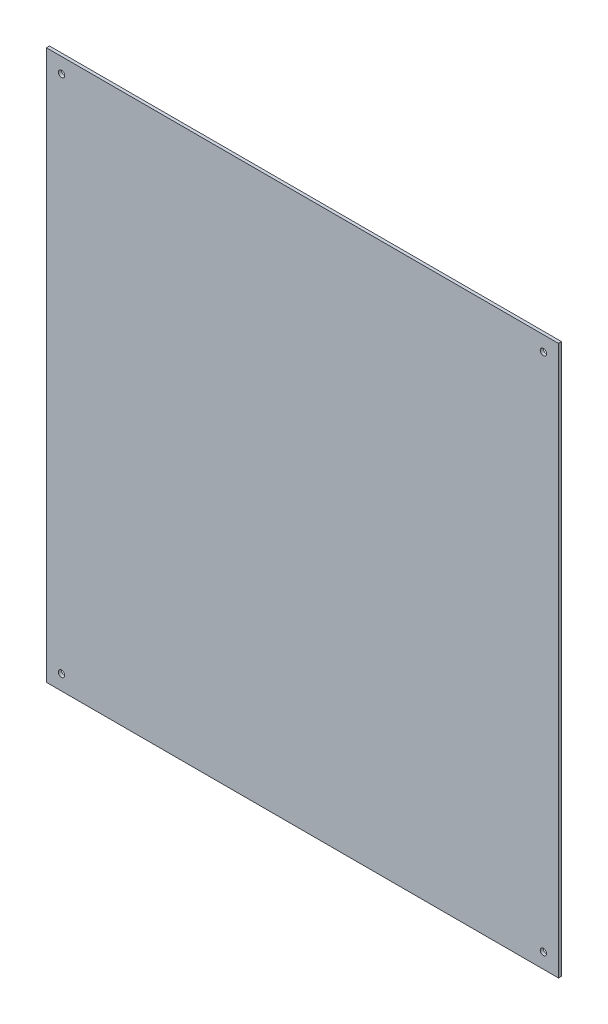
ISO-10303-21;
HEADER;
FILE_DESCRIPTION(('STEP AP214'),'2;1');
FILE_NAME('part.step','',(''),(''),'','','');
FILE_SCHEMA(('AUTOMOTIVE_DESIGN { 1 0 10303 214 1 1 1 1 }'));
ENDSEC;
DATA;
#1=APPLICATION_CONTEXT('core data for automotive mechanical design processes');
#2=APPLICATION_PROTOCOL_DEFINITION('international standard','automotive_design',2000,#1);
#3=PRODUCT_CONTEXT('',#1,'mechanical');
#4=PRODUCT('Part','Part','',(#3));
#5=PRODUCT_RELATED_PRODUCT_CATEGORY('part','',(#4));
#6=PRODUCT_DEFINITION_FORMATION('','',#4);
#7=PRODUCT_DEFINITION_CONTEXT('part definition',#1,'design');
#8=PRODUCT_DEFINITION('design','',#6,#7);
#9=PRODUCT_DEFINITION_SHAPE('','',#8);
#10=(LENGTH_UNIT() NAMED_UNIT(*) SI_UNIT(.MILLI.,.METRE.));
#11=(NAMED_UNIT(*) PLANE_ANGLE_UNIT() SI_UNIT($,.RADIAN.));
#12=(NAMED_UNIT(*) SI_UNIT($,.STERADIAN.) SOLID_ANGLE_UNIT());
#13=UNCERTAINTY_MEASURE_WITH_UNIT(LENGTH_MEASURE(1.E-05),#10,'distance_accuracy_value','');
#14=(GEOMETRIC_REPRESENTATION_CONTEXT(3) GLOBAL_UNCERTAINTY_ASSIGNED_CONTEXT((#13)) GLOBAL_UNIT_ASSIGNED_CONTEXT((#10,
#11,#12)) REPRESENTATION_CONTEXT('',''));
#15=CARTESIAN_POINT('',(0.,0.,0.));
#16=DIRECTION('',(0.,0.,1.));
#17=DIRECTION('',(1.,0.,0.));
#18=AXIS2_PLACEMENT_3D('',#15,#16,#17);
#19=CARTESIAN_POINT('',(0.,0.,2.032));
#20=DIRECTION('',(0.,0.,-1.));
#21=DIRECTION('',(-1.,0.,0.));
#22=AXIS2_PLACEMENT_3D('',#19,#20,#21);
#23=PLANE('',#22);
#24=DIRECTION('',(0.,-1.,0.));
#25=VECTOR('',#24,1.);
#26=CARTESIAN_POINT('',(-170.,-182.5,2.032));
#27=LINE('',#26,#25);
#28=CARTESIAN_POINT('',(-170.,182.5,2.032));
#29=VERTEX_POINT('',#28);
#30=CARTESIAN_POINT('',(-170.,-182.5,2.032));
#31=VERTEX_POINT('',#30);
#32=EDGE_CURVE('E85',#29,#31,#27,.T.);
#33=ORIENTED_EDGE('',*,*,#32,.T.);
#34=DIRECTION('',(1.,0.,0.));
#35=VECTOR('',#34,1.);
#36=CARTESIAN_POINT('',(170.,-182.5,2.032));
#37=LINE('',#36,#35);
#38=CARTESIAN_POINT('',(170.,-182.5,2.032));
#39=VERTEX_POINT('',#38);
#40=EDGE_CURVE('E80',#31,#39,#37,.T.);
#41=ORIENTED_EDGE('',*,*,#40,.T.);
#42=DIRECTION('',(0.,1.,0.));
#43=VECTOR('',#42,1.);
#44=CARTESIAN_POINT('',(170.,182.5,2.032));
#45=LINE('',#44,#43);
#46=CARTESIAN_POINT('',(170.,182.5,2.032));
#47=VERTEX_POINT('',#46);
#48=EDGE_CURVE('E83',#39,#47,#45,.T.);
#49=ORIENTED_EDGE('',*,*,#48,.T.);
#50=DIRECTION('',(-1.,0.,0.));
#51=VECTOR('',#50,1.);
#52=CARTESIAN_POINT('',(-170.,182.5,2.032));
#53=LINE('',#52,#51);
#54=EDGE_CURVE('E50',#47,#29,#53,.T.);
#55=ORIENTED_EDGE('',*,*,#54,.T.);
#56=EDGE_LOOP('',(#33,#41,#49,#55));
#57=FACE_BOUND('',#56,.T.);
#58=CARTESIAN_POINT('',(-160.,-172.5,2.032));
#59=DIRECTION('',(0.,0.,1.));
#60=DIRECTION('',(1.,0.,0.));
#61=AXIS2_PLACEMENT_3D('',#58,#59,#60);
#62=CIRCLE('',#61,2.09999999999999);
#63=CARTESIAN_POINT('',(-157.9,-172.5,2.032));
#64=VERTEX_POINT('',#63);
#65=EDGE_CURVE('E100',#64,#64,#62,.T.);
#66=ORIENTED_EDGE('',*,*,#65,.F.);
#67=EDGE_LOOP('',(#66));
#68=FACE_BOUND('',#67,.T.);
#69=CARTESIAN_POINT('',(160.,-172.5,2.032));
#70=DIRECTION('',(0.,0.,1.));
#71=DIRECTION('',(1.,0.,0.));
#72=AXIS2_PLACEMENT_3D('',#69,#70,#71);
#73=CIRCLE('',#72,2.09999999999999);
#74=CARTESIAN_POINT('',(162.1,-172.5,2.032));
#75=VERTEX_POINT('',#74);
#76=EDGE_CURVE('E115',#75,#75,#73,.T.);
#77=ORIENTED_EDGE('',*,*,#76,.F.);
#78=EDGE_LOOP('',(#77));
#79=FACE_BOUND('',#78,.T.);
#80=CARTESIAN_POINT('',(160.,172.5,2.032));
#81=DIRECTION('',(0.,0.,1.));
#82=DIRECTION('',(1.,0.,0.));
#83=AXIS2_PLACEMENT_3D('',#80,#81,#82);
#84=CIRCLE('',#83,2.09999999999999);
#85=CARTESIAN_POINT('',(162.1,172.5,2.032));
#86=VERTEX_POINT('',#85);
#87=EDGE_CURVE('E121',#86,#86,#84,.T.);
#88=ORIENTED_EDGE('',*,*,#87,.F.);
#89=EDGE_LOOP('',(#88));
#90=FACE_BOUND('',#89,.T.);
#91=CARTESIAN_POINT('',(-160.,172.5,2.032));
#92=DIRECTION('',(0.,0.,1.));
#93=DIRECTION('',(1.,0.,0.));
#94=AXIS2_PLACEMENT_3D('',#91,#92,#93);
#95=CIRCLE('',#94,2.09999999999999);
#96=CARTESIAN_POINT('',(-157.9,172.5,2.032));
#97=VERTEX_POINT('',#96);
#98=EDGE_CURVE('E127',#97,#97,#95,.T.);
#99=ORIENTED_EDGE('',*,*,#98,.F.);
#100=EDGE_LOOP('',(#99));
#101=FACE_BOUND('',#100,.T.);
#102=ADVANCED_FACE('F33',(#57,#68,#79,#90,#101),#23,.F.);
#103=CARTESIAN_POINT('',(0.,0.,0.));
#104=DIRECTION('',(0.,0.,-1.));
#105=DIRECTION('',(-1.,0.,0.));
#106=AXIS2_PLACEMENT_3D('',#103,#104,#105);
#107=PLANE('',#106);
#108=CARTESIAN_POINT('',(160.,172.5,0.));
#109=DIRECTION('',(0.,0.,1.));
#110=DIRECTION('',(1.,0.,0.));
#111=AXIS2_PLACEMENT_3D('',#108,#109,#110);
#112=CIRCLE('',#111,2.09999999999999);
#113=CARTESIAN_POINT('',(162.1,172.5,0.));
#114=VERTEX_POINT('',#113);
#115=EDGE_CURVE('E124',#114,#114,#112,.T.);
#116=ORIENTED_EDGE('',*,*,#115,.T.);
#117=EDGE_LOOP('',(#116));
#118=FACE_BOUND('',#117,.T.);
#119=CARTESIAN_POINT('',(-160.,-172.5,0.));
#120=DIRECTION('',(0.,0.,1.));
#121=DIRECTION('',(1.,0.,0.));
#122=AXIS2_PLACEMENT_3D('',#119,#120,#121);
#123=CIRCLE('',#122,2.09999999999999);
#124=CARTESIAN_POINT('',(-157.9,-172.5,0.));
#125=VERTEX_POINT('',#124);
#126=EDGE_CURVE('E112',#125,#125,#123,.T.);
#127=ORIENTED_EDGE('',*,*,#126,.T.);
#128=EDGE_LOOP('',(#127));
#129=FACE_BOUND('',#128,.T.);
#130=DIRECTION('',(0.,-1.,0.));
#131=VECTOR('',#130,1.);
#132=CARTESIAN_POINT('',(-170.,-182.5,0.));
#133=LINE('',#132,#131);
#134=CARTESIAN_POINT('',(-170.,182.5,0.));
#135=VERTEX_POINT('',#134);
#136=CARTESIAN_POINT('',(-170.,-182.5,0.));
#137=VERTEX_POINT('',#136);
#138=EDGE_CURVE('E97',#135,#137,#133,.T.);
#139=ORIENTED_EDGE('',*,*,#138,.F.);
#140=DIRECTION('',(-1.,0.,0.));
#141=VECTOR('',#140,1.);
#142=CARTESIAN_POINT('',(-170.,182.5,0.));
#143=LINE('',#142,#141);
#144=CARTESIAN_POINT('',(170.,182.5,0.));
#145=VERTEX_POINT('',#144);
#146=EDGE_CURVE('E73',#145,#135,#143,.T.);
#147=ORIENTED_EDGE('',*,*,#146,.F.);
#148=DIRECTION('',(0.,1.,0.));
#149=VECTOR('',#148,1.);
#150=CARTESIAN_POINT('',(170.,182.5,0.));
#151=LINE('',#150,#149);
#152=CARTESIAN_POINT('',(170.,-182.5,0.));
#153=VERTEX_POINT('',#152);
#154=EDGE_CURVE('E67',#153,#145,#151,.T.);
#155=ORIENTED_EDGE('',*,*,#154,.F.);
#156=DIRECTION('',(1.,0.,0.));
#157=VECTOR('',#156,1.);
#158=CARTESIAN_POINT('',(170.,-182.5,0.));
#159=LINE('',#158,#157);
#160=EDGE_CURVE('E89',#137,#153,#159,.T.);
#161=ORIENTED_EDGE('',*,*,#160,.F.);
#162=EDGE_LOOP('',(#139,#147,#155,#161));
#163=FACE_BOUND('',#162,.T.);
#164=CARTESIAN_POINT('',(160.,-172.5,0.));
#165=DIRECTION('',(0.,0.,1.));
#166=DIRECTION('',(1.,0.,0.));
#167=AXIS2_PLACEMENT_3D('',#164,#165,#166);
#168=CIRCLE('',#167,2.09999999999999);
#169=CARTESIAN_POINT('',(162.1,-172.5,0.));
#170=VERTEX_POINT('',#169);
#171=EDGE_CURVE('E118',#170,#170,#168,.T.);
#172=ORIENTED_EDGE('',*,*,#171,.T.);
#173=EDGE_LOOP('',(#172));
#174=FACE_BOUND('',#173,.T.);
#175=CARTESIAN_POINT('',(-160.,172.5,0.));
#176=DIRECTION('',(0.,0.,1.));
#177=DIRECTION('',(1.,0.,0.));
#178=AXIS2_PLACEMENT_3D('',#175,#176,#177);
#179=CIRCLE('',#178,2.09999999999999);
#180=CARTESIAN_POINT('',(-157.9,172.5,0.));
#181=VERTEX_POINT('',#180);
#182=EDGE_CURVE('E130',#181,#181,#179,.T.);
#183=ORIENTED_EDGE('',*,*,#182,.T.);
#184=EDGE_LOOP('',(#183));
#185=FACE_BOUND('',#184,.T.);
#186=ADVANCED_FACE('F108',(#118,#129,#163,#174,#185),#107,.T.);
#187=CARTESIAN_POINT('',(-170.,-182.5,2.032));
#188=DIRECTION('',(1.,0.,0.));
#189=DIRECTION('',(0.,0.,-1.));
#190=AXIS2_PLACEMENT_3D('',#187,#188,#189);
#191=PLANE('',#190);
#192=ORIENTED_EDGE('',*,*,#138,.T.);
#193=DIRECTION('',(0.,0.,-1.));
#194=VECTOR('',#193,1.);
#195=CARTESIAN_POINT('',(-170.,-182.5,2.032));
#196=LINE('',#195,#194);
#197=EDGE_CURVE('E11',#31,#137,#196,.T.);
#198=ORIENTED_EDGE('',*,*,#197,.F.);
#199=ORIENTED_EDGE('',*,*,#32,.F.);
#200=DIRECTION('',(0.,0.,-1.));
#201=VECTOR('',#200,1.);
#202=CARTESIAN_POINT('',(-170.,182.5,2.032));
#203=LINE('',#202,#201);
#204=EDGE_CURVE('E93',#29,#135,#203,.T.);
#205=ORIENTED_EDGE('',*,*,#204,.T.);
#206=EDGE_LOOP('',(#192,#198,#199,#205));
#207=FACE_BOUND('',#206,.T.);
#208=ADVANCED_FACE('F35',(#207),#191,.F.);
#209=CARTESIAN_POINT('',(170.,-182.5,2.032));
#210=DIRECTION('',(0.,1.,0.));
#211=DIRECTION('',(0.,0.,1.));
#212=AXIS2_PLACEMENT_3D('',#209,#210,#211);
#213=PLANE('',#212);
#214=ORIENTED_EDGE('',*,*,#160,.T.);
#215=DIRECTION('',(0.,0.,-1.));
#216=VECTOR('',#215,1.);
#217=CARTESIAN_POINT('',(170.,-182.5,2.032));
#218=LINE('',#217,#216);
#219=EDGE_CURVE('E42',#39,#153,#218,.T.);
#220=ORIENTED_EDGE('',*,*,#219,.F.);
#221=ORIENTED_EDGE('',*,*,#40,.F.);
#222=ORIENTED_EDGE('',*,*,#197,.T.);
#223=EDGE_LOOP('',(#214,#220,#221,#222));
#224=FACE_BOUND('',#223,.T.);
#225=ADVANCED_FACE('F88',(#224),#213,.F.);
#226=CARTESIAN_POINT('',(170.,182.5,2.032));
#227=DIRECTION('',(-1.,0.,0.));
#228=DIRECTION('',(0.,0.,1.));
#229=AXIS2_PLACEMENT_3D('',#226,#227,#228);
#230=PLANE('',#229);
#231=ORIENTED_EDGE('',*,*,#154,.T.);
#232=DIRECTION('',(0.,0.,-1.));
#233=VECTOR('',#232,1.);
#234=CARTESIAN_POINT('',(170.,182.5,2.032));
#235=LINE('',#234,#233);
#236=EDGE_CURVE('E90',#47,#145,#235,.T.);
#237=ORIENTED_EDGE('',*,*,#236,.F.);
#238=ORIENTED_EDGE('',*,*,#48,.F.);
#239=ORIENTED_EDGE('',*,*,#219,.T.);
#240=EDGE_LOOP('',(#231,#237,#238,#239));
#241=FACE_BOUND('',#240,.T.);
#242=ADVANCED_FACE('F91',(#241),#230,.F.);
#243=CARTESIAN_POINT('',(-170.,182.5,2.032));
#244=DIRECTION('',(0.,-1.,0.));
#245=DIRECTION('',(0.,0.,-1.));
#246=AXIS2_PLACEMENT_3D('',#243,#244,#245);
#247=PLANE('',#246);
#248=ORIENTED_EDGE('',*,*,#146,.T.);
#249=ORIENTED_EDGE('',*,*,#204,.F.);
#250=ORIENTED_EDGE('',*,*,#54,.F.);
#251=ORIENTED_EDGE('',*,*,#236,.T.);
#252=EDGE_LOOP('',(#248,#249,#250,#251));
#253=FACE_BOUND('',#252,.T.);
#254=ADVANCED_FACE('F105',(#253),#247,.F.);
#255=CARTESIAN_POINT('',(-160.,-172.5,2.032));
#256=DIRECTION('',(0.,0.,-1.));
#257=DIRECTION('',(-1.,0.,0.));
#258=AXIS2_PLACEMENT_3D('',#255,#256,#257);
#259=CYLINDRICAL_SURFACE('',#258,2.09999999999999);
#260=ORIENTED_EDGE('',*,*,#65,.T.);
#261=EDGE_LOOP('',(#260));
#262=FACE_BOUND('',#261,.T.);
#263=ORIENTED_EDGE('',*,*,#126,.F.);
#264=EDGE_LOOP('',(#263));
#265=FACE_BOUND('',#264,.T.);
#266=ADVANCED_FACE('F147',(#262,#265),#259,.F.);
#267=CARTESIAN_POINT('',(160.,-172.5,2.032));
#268=DIRECTION('',(0.,0.,-1.));
#269=DIRECTION('',(-1.,0.,0.));
#270=AXIS2_PLACEMENT_3D('',#267,#268,#269);
#271=CYLINDRICAL_SURFACE('',#270,2.09999999999999);
#272=ORIENTED_EDGE('',*,*,#76,.T.);
#273=EDGE_LOOP('',(#272));
#274=FACE_BOUND('',#273,.T.);
#275=ORIENTED_EDGE('',*,*,#171,.F.);
#276=EDGE_LOOP('',(#275));
#277=FACE_BOUND('',#276,.T.);
#278=ADVANCED_FACE('F193',(#274,#277),#271,.F.);
#279=CARTESIAN_POINT('',(160.,172.5,2.032));
#280=DIRECTION('',(0.,0.,-1.));
#281=DIRECTION('',(-1.,0.,0.));
#282=AXIS2_PLACEMENT_3D('',#279,#280,#281);
#283=CYLINDRICAL_SURFACE('',#282,2.09999999999999);
#284=ORIENTED_EDGE('',*,*,#87,.T.);
#285=EDGE_LOOP('',(#284));
#286=FACE_BOUND('',#285,.T.);
#287=ORIENTED_EDGE('',*,*,#115,.F.);
#288=EDGE_LOOP('',(#287));
#289=FACE_BOUND('',#288,.T.);
#290=ADVANCED_FACE('F201',(#286,#289),#283,.F.);
#291=CARTESIAN_POINT('',(-160.,172.5,2.032));
#292=DIRECTION('',(0.,0.,-1.));
#293=DIRECTION('',(-1.,0.,0.));
#294=AXIS2_PLACEMENT_3D('',#291,#292,#293);
#295=CYLINDRICAL_SURFACE('',#294,2.09999999999999);
#296=ORIENTED_EDGE('',*,*,#98,.T.);
#297=EDGE_LOOP('',(#296));
#298=FACE_BOUND('',#297,.T.);
#299=ORIENTED_EDGE('',*,*,#182,.F.);
#300=EDGE_LOOP('',(#299));
#301=FACE_BOUND('',#300,.T.);
#302=ADVANCED_FACE('F136',(#298,#301),#295,.F.);
#303=CLOSED_SHELL('',(#102,#186,#208,#225,#242,#254,#266,#278,#290,#302));
#304=MANIFOLD_SOLID_BREP('B2',#303);
#305=ADVANCED_BREP_SHAPE_REPRESENTATION('',(#18,#304),#14);
#306=SHAPE_DEFINITION_REPRESENTATION(#9,#305);
ENDSEC;
END-ISO-10303-21;
